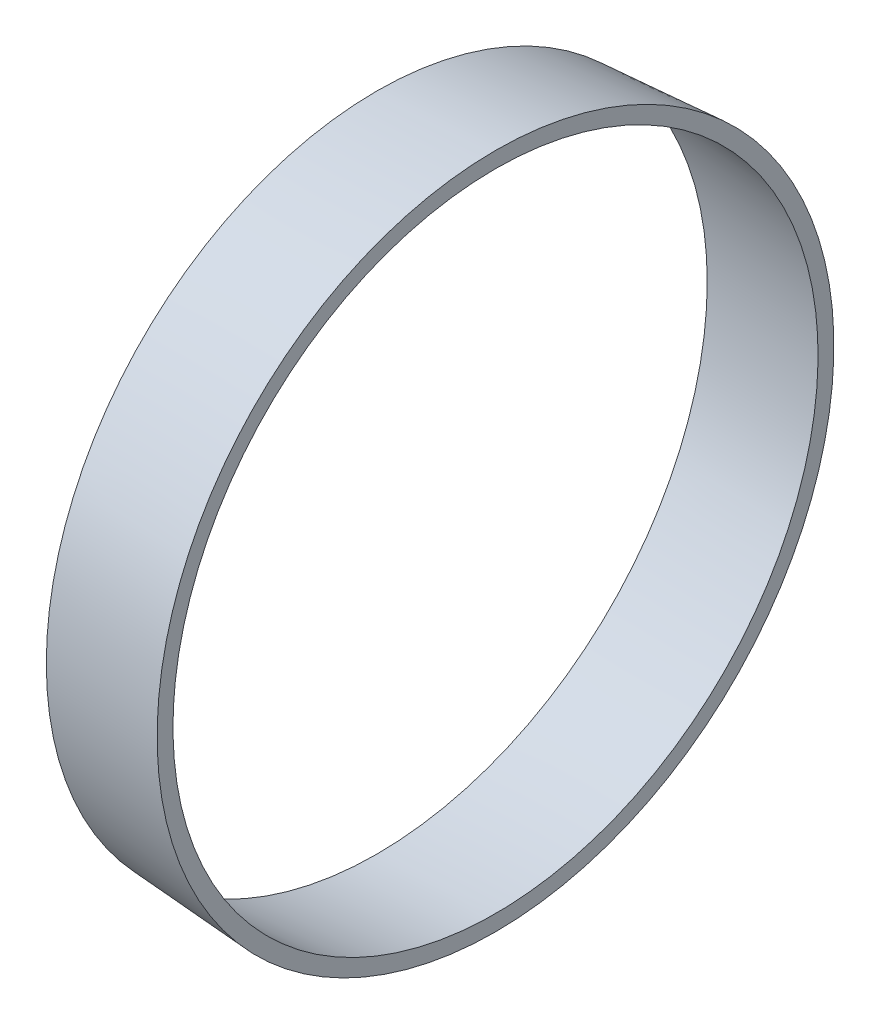
ISO-10303-21;
HEADER;
FILE_DESCRIPTION(('STEP AP214'),'2;1');
FILE_NAME('part.step','',(''),(''),'','','');
FILE_SCHEMA(('AUTOMOTIVE_DESIGN { 1 0 10303 214 1 1 1 1 }'));
ENDSEC;
DATA;
#1=APPLICATION_CONTEXT('core data for automotive mechanical design processes');
#2=APPLICATION_PROTOCOL_DEFINITION('international standard','automotive_design',2000,#1);
#3=PRODUCT_CONTEXT('',#1,'mechanical');
#4=PRODUCT('Part','Part','',(#3));
#5=PRODUCT_RELATED_PRODUCT_CATEGORY('part','',(#4));
#6=PRODUCT_DEFINITION_FORMATION('','',#4);
#7=PRODUCT_DEFINITION_CONTEXT('part definition',#1,'design');
#8=PRODUCT_DEFINITION('design','',#6,#7);
#9=PRODUCT_DEFINITION_SHAPE('','',#8);
#10=(LENGTH_UNIT() NAMED_UNIT(*) SI_UNIT(.MILLI.,.METRE.));
#11=(NAMED_UNIT(*) PLANE_ANGLE_UNIT() SI_UNIT($,.RADIAN.));
#12=(NAMED_UNIT(*) SI_UNIT($,.STERADIAN.) SOLID_ANGLE_UNIT());
#13=UNCERTAINTY_MEASURE_WITH_UNIT(LENGTH_MEASURE(1.E-05),#10,'distance_accuracy_value','');
#14=(GEOMETRIC_REPRESENTATION_CONTEXT(3) GLOBAL_UNCERTAINTY_ASSIGNED_CONTEXT((#13)) GLOBAL_UNIT_ASSIGNED_CONTEXT((#10,
#11,#12)) REPRESENTATION_CONTEXT('',''));
#15=CARTESIAN_POINT('',(0.,0.,0.));
#16=DIRECTION('',(0.,0.,1.));
#17=DIRECTION('',(1.,0.,0.));
#18=AXIS2_PLACEMENT_3D('',#15,#16,#17);
#19=CARTESIAN_POINT('',(100.,0.,0.));
#20=DIRECTION('',(-1.,0.,0.));
#21=DIRECTION('',(0.,0.,1.));
#22=AXIS2_PLACEMENT_3D('',#19,#20,#21);
#23=CONICAL_SURFACE('',#22,1670.,0.0665681637758239);
#24=CARTESIAN_POINT('',(700.,0.,0.));
#25=DIRECTION('',(-1.,0.,0.));
#26=DIRECTION('',(0.,0.,1.));
#27=AXIS2_PLACEMENT_3D('',#24,#25,#26);
#28=CIRCLE('',#27,1630.);
#29=CARTESIAN_POINT('',(700.,1630.,-1.17027252772837E-05));
#30=VERTEX_POINT('',#29);
#31=CARTESIAN_POINT('',(700.,1630.,0.));
#32=VERTEX_POINT('',#31);
#33=EDGE_CURVE('E11',#30,#32,#28,.T.);
#34=ORIENTED_EDGE('',*,*,#33,.F.);
#35=DIRECTION('',(0.997785157856609,-0.066519010523774,4.77578960660409E-10));
#36=VECTOR('',#35,1.);
#37=CARTESIAN_POINT('',(700.,1630.,-1.17027252772837E-05));
#38=LINE('',#37,#36);
#39=CARTESIAN_POINT('',(100.,1670.,-1.1989908719671E-05));
#40=VERTEX_POINT('',#39);
#41=EDGE_CURVE('E82',#40,#30,#38,.T.);
#42=ORIENTED_EDGE('',*,*,#41,.F.);
#43=CARTESIAN_POINT('',(100.,0.,0.));
#44=DIRECTION('',(-1.,0.,0.));
#45=DIRECTION('',(0.,0.,1.));
#46=AXIS2_PLACEMENT_3D('',#43,#44,#45);
#47=CIRCLE('',#46,1670.);
#48=CARTESIAN_POINT('',(100.,1670.,0.));
#49=VERTEX_POINT('',#48);
#50=EDGE_CURVE('E53',#40,#49,#47,.T.);
#51=ORIENTED_EDGE('',*,*,#50,.T.);
#52=DIRECTION('',(0.997785157856609,-0.066519010523774,0.));
#53=VECTOR('',#52,1.);
#54=CARTESIAN_POINT('',(700.,1630.,0.));
#55=LINE('',#54,#53);
#56=EDGE_CURVE('E80',#49,#32,#55,.T.);
#57=ORIENTED_EDGE('',*,*,#56,.T.);
#58=EDGE_LOOP('',(#34,#42,#51,#57));
#59=FACE_BOUND('',#58,.T.);
#60=ADVANCED_FACE('F39',(#59),#23,.F.);
#61=CARTESIAN_POINT('',(700.,1710.,-1.22770921620583E-05));
#62=DIRECTION('',(-1.,0.,0.));
#63=DIRECTION('',(0.,0.,1.));
#64=AXIS2_PLACEMENT_3D('',#61,#62,#63);
#65=PLANE('',#64);
#66=CARTESIAN_POINT('',(700.,0.,0.));
#67=DIRECTION('',(-1.,0.,0.));
#68=DIRECTION('',(0.,0.,1.));
#69=AXIS2_PLACEMENT_3D('',#66,#67,#68);
#70=CIRCLE('',#69,1710.);
#71=CARTESIAN_POINT('',(700.,1710.,-1.22770921620583E-05));
#72=VERTEX_POINT('',#71);
#73=CARTESIAN_POINT('',(700.,1710.,0.));
#74=VERTEX_POINT('',#73);
#75=EDGE_CURVE('E50',#72,#74,#70,.T.);
#76=ORIENTED_EDGE('',*,*,#75,.F.);
#77=DIRECTION('',(0.,1.,-7.17958605968322E-09));
#78=VECTOR('',#77,1.);
#79=CARTESIAN_POINT('',(700.,1710.,-1.22770921620583E-05));
#80=LINE('',#79,#78);
#81=EDGE_CURVE('E75',#30,#72,#80,.T.);
#82=ORIENTED_EDGE('',*,*,#81,.F.);
#83=ORIENTED_EDGE('',*,*,#33,.T.);
#84=DIRECTION('',(0.,1.,0.));
#85=VECTOR('',#84,1.);
#86=CARTESIAN_POINT('',(700.,1710.,0.));
#87=LINE('',#86,#85);
#88=EDGE_CURVE('E74',#32,#74,#87,.T.);
#89=ORIENTED_EDGE('',*,*,#88,.T.);
#90=EDGE_LOOP('',(#76,#82,#83,#89));
#91=FACE_BOUND('',#90,.T.);
#92=ADVANCED_FACE('F41',(#91),#65,.F.);
#93=CARTESIAN_POINT('',(700.,0.,0.));
#94=DIRECTION('',(1.,0.,0.));
#95=DIRECTION('',(0.,0.,-1.));
#96=AXIS2_PLACEMENT_3D('',#93,#94,#95);
#97=CONICAL_SURFACE('',#96,1710.,0.0665681637758239);
#98=DIRECTION('',(-0.997785157856609,-0.066519010523774,4.77578960660409E-10));
#99=VECTOR('',#98,1.);
#100=CARTESIAN_POINT('',(100.,1670.,-1.1989908719671E-05));
#101=LINE('',#100,#99);
#102=EDGE_CURVE('E89',#72,#40,#101,.T.);
#103=ORIENTED_EDGE('',*,*,#102,.F.);
#104=ORIENTED_EDGE('',*,*,#75,.T.);
#105=DIRECTION('',(-0.997785157856609,-0.066519010523774,0.));
#106=VECTOR('',#105,1.);
#107=CARTESIAN_POINT('',(100.,1670.,0.));
#108=LINE('',#107,#106);
#109=EDGE_CURVE('E81',#74,#49,#108,.T.);
#110=ORIENTED_EDGE('',*,*,#109,.T.);
#111=ORIENTED_EDGE('',*,*,#50,.F.);
#112=EDGE_LOOP('',(#103,#104,#110,#111));
#113=FACE_BOUND('',#112,.T.);
#114=ADVANCED_FACE('F93',(#113),#97,.T.);
#115=CARTESIAN_POINT('',(0.,0.,0.));
#116=DIRECTION('',(0.,7.17958605968322E-09,1.));
#117=DIRECTION('',(1.,0.,0.));
#118=AXIS2_PLACEMENT_3D('',#115,#116,#117);
#119=PLANE('',#118);
#120=ORIENTED_EDGE('',*,*,#41,.T.);
#121=ORIENTED_EDGE('',*,*,#81,.T.);
#122=ORIENTED_EDGE('',*,*,#102,.T.);
#123=EDGE_LOOP('',(#120,#121,#122));
#124=FACE_BOUND('',#123,.T.);
#125=ADVANCED_FACE('F94',(#124),#119,.T.);
#126=CARTESIAN_POINT('',(0.,0.,0.));
#127=DIRECTION('',(0.,0.,1.));
#128=DIRECTION('',(1.,0.,0.));
#129=AXIS2_PLACEMENT_3D('',#126,#127,#128);
#130=PLANE('',#129);
#131=ORIENTED_EDGE('',*,*,#56,.F.);
#132=ORIENTED_EDGE('',*,*,#109,.F.);
#133=ORIENTED_EDGE('',*,*,#88,.F.);
#134=EDGE_LOOP('',(#131,#132,#133));
#135=FACE_BOUND('',#134,.T.);
#136=ADVANCED_FACE('F85',(#135),#130,.F.);
#137=CLOSED_SHELL('',(#60,#92,#114,#125,#136));
#138=MANIFOLD_SOLID_BREP('B2',#137);
#139=ADVANCED_BREP_SHAPE_REPRESENTATION('',(#18,#138),#14);
#140=SHAPE_DEFINITION_REPRESENTATION(#9,#139);
ENDSEC;
END-ISO-10303-21;
